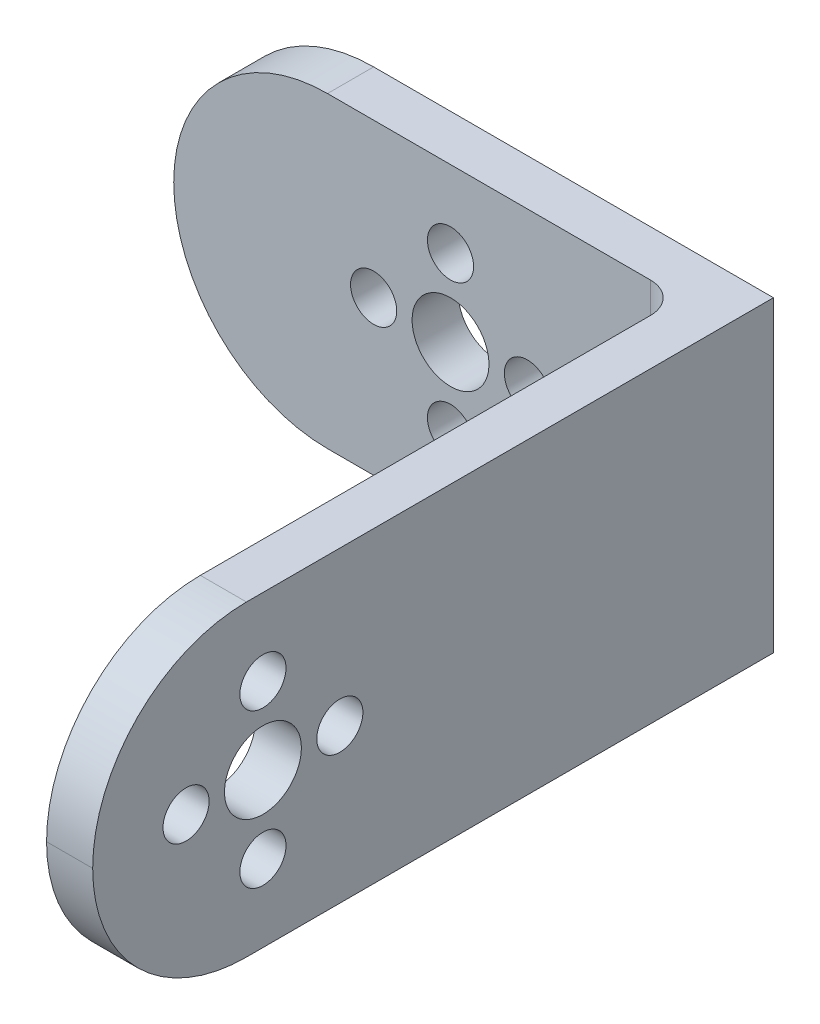
ISO-10303-21;
HEADER;
FILE_DESCRIPTION(('STEP AP214'),'2;1');
FILE_NAME('part.step','',(''),(''),'','','');
FILE_SCHEMA(('AUTOMOTIVE_DESIGN { 1 0 10303 214 1 1 1 1 }'));
ENDSEC;
DATA;
#1=APPLICATION_CONTEXT('core data for automotive mechanical design processes');
#2=APPLICATION_PROTOCOL_DEFINITION('international standard','automotive_design',2000,#1);
#3=PRODUCT_CONTEXT('',#1,'mechanical');
#4=PRODUCT('Part','Part','',(#3));
#5=PRODUCT_RELATED_PRODUCT_CATEGORY('part','',(#4));
#6=PRODUCT_DEFINITION_FORMATION('','',#4);
#7=PRODUCT_DEFINITION_CONTEXT('part definition',#1,'design');
#8=PRODUCT_DEFINITION('design','',#6,#7);
#9=PRODUCT_DEFINITION_SHAPE('','',#8);
#10=(LENGTH_UNIT() NAMED_UNIT(*) SI_UNIT(.MILLI.,.METRE.));
#11=(NAMED_UNIT(*) PLANE_ANGLE_UNIT() SI_UNIT($,.RADIAN.));
#12=(NAMED_UNIT(*) SI_UNIT($,.STERADIAN.) SOLID_ANGLE_UNIT());
#13=UNCERTAINTY_MEASURE_WITH_UNIT(LENGTH_MEASURE(1.E-05),#10,'distance_accuracy_value','');
#14=(GEOMETRIC_REPRESENTATION_CONTEXT(3) GLOBAL_UNCERTAINTY_ASSIGNED_CONTEXT((#13)) GLOBAL_UNIT_ASSIGNED_CONTEXT((#10,
#11,#12)) REPRESENTATION_CONTEXT('',''));
#15=CARTESIAN_POINT('',(0.,0.,0.));
#16=DIRECTION('',(0.,0.,1.));
#17=DIRECTION('',(1.,0.,0.));
#18=AXIS2_PLACEMENT_3D('',#15,#16,#17);
#19=CARTESIAN_POINT('',(0.,20.,41.27));
#20=DIRECTION('',(0.,1.,0.));
#21=DIRECTION('',(0.,0.,1.));
#22=AXIS2_PLACEMENT_3D('',#19,#20,#21);
#23=PLANE('',#22);
#24=DIRECTION('',(1.,0.,0.));
#25=VECTOR('',#24,1.);
#26=CARTESIAN_POINT('',(0.,20.,-3.));
#27=LINE('',#26,#25);
#28=CARTESIAN_POINT('',(10.,20.,-3.));
#29=VERTEX_POINT('',#28);
#30=CARTESIAN_POINT('',(36.,20.,-3.));
#31=VERTEX_POINT('',#30);
#32=EDGE_CURVE('E113',#29,#31,#27,.T.);
#33=ORIENTED_EDGE('',*,*,#32,.F.);
#34=DIRECTION('',(0.,0.,1.));
#35=VECTOR('',#34,1.);
#36=CARTESIAN_POINT('',(10.,20.,0.));
#37=LINE('',#36,#35);
#38=CARTESIAN_POINT('',(10.,20.,0.));
#39=VERTEX_POINT('',#38);
#40=EDGE_CURVE('E163',#29,#39,#37,.T.);
#41=ORIENTED_EDGE('',*,*,#40,.T.);
#42=DIRECTION('',(1.,0.,0.));
#43=VECTOR('',#42,1.);
#44=CARTESIAN_POINT('',(0.,20.,0.));
#45=LINE('',#44,#43);
#46=CARTESIAN_POINT('',(31.,20.,0.));
#47=VERTEX_POINT('',#46);
#48=EDGE_CURVE('E141',#39,#47,#45,.T.);
#49=ORIENTED_EDGE('',*,*,#48,.T.);
#50=CARTESIAN_POINT('',(31.,20.,2.));
#51=DIRECTION('',(0.,1.,0.));
#52=DIRECTION('',(0.,0.,1.));
#53=AXIS2_PLACEMENT_3D('',#50,#51,#52);
#54=CIRCLE('',#53,2.);
#55=CARTESIAN_POINT('',(33.,20.,2.));
#56=VERTEX_POINT('',#55);
#57=EDGE_CURVE('E159',#47,#56,#54,.F.);
#58=ORIENTED_EDGE('',*,*,#57,.T.);
#59=DIRECTION('',(0.,0.,-1.));
#60=VECTOR('',#59,1.);
#61=CARTESIAN_POINT('',(33.,20.,41.27));
#62=LINE('',#61,#60);
#63=CARTESIAN_POINT('',(33.,20.,31.27));
#64=VERTEX_POINT('',#63);
#65=EDGE_CURVE('E148',#64,#56,#62,.T.);
#66=ORIENTED_EDGE('',*,*,#65,.F.);
#67=DIRECTION('',(1.,0.,0.));
#68=VECTOR('',#67,1.);
#69=CARTESIAN_POINT('',(0.,20.,31.27));
#70=LINE('',#69,#68);
#71=CARTESIAN_POINT('',(36.,20.,31.27));
#72=VERTEX_POINT('',#71);
#73=EDGE_CURVE('E130',#64,#72,#70,.T.);
#74=ORIENTED_EDGE('',*,*,#73,.T.);
#75=DIRECTION('',(0.,0.,-1.));
#76=VECTOR('',#75,1.);
#77=CARTESIAN_POINT('',(36.,20.,41.27));
#78=LINE('',#77,#76);
#79=EDGE_CURVE('E127',#72,#31,#78,.T.);
#80=ORIENTED_EDGE('',*,*,#79,.T.);
#81=EDGE_LOOP('',(#33,#41,#49,#58,#66,#74,#80));
#82=FACE_BOUND('',#81,.T.);
#83=ADVANCED_FACE('F41',(#82),#23,.T.);
#84=CARTESIAN_POINT('',(33.,0.,41.27));
#85=DIRECTION('',(1.,0.,0.));
#86=DIRECTION('',(0.,0.,-1.));
#87=AXIS2_PLACEMENT_3D('',#84,#85,#86);
#88=PLANE('',#87);
#89=CARTESIAN_POINT('',(33.,15.,30.1978748806243));
#90=DIRECTION('',(1.,0.,0.));
#91=DIRECTION('',(0.,0.,-1.));
#92=AXIS2_PLACEMENT_3D('',#89,#90,#91);
#93=CIRCLE('',#92,1.5);
#94=CARTESIAN_POINT('',(33.,15.,28.6978748806243));
#95=VERTEX_POINT('',#94);
#96=EDGE_CURVE('E143',#95,#95,#93,.T.);
#97=ORIENTED_EDGE('',*,*,#96,.T.);
#98=EDGE_LOOP('',(#97));
#99=FACE_BOUND('',#98,.T.);
#100=CARTESIAN_POINT('',(33.,10.,30.1978748806243));
#101=DIRECTION('',(1.,0.,0.));
#102=DIRECTION('',(0.,0.,-1.));
#103=AXIS2_PLACEMENT_3D('',#100,#101,#102);
#104=CIRCLE('',#103,2.49999999999999);
#105=CARTESIAN_POINT('',(33.,10.,27.6978748806243));
#106=VERTEX_POINT('',#105);
#107=EDGE_CURVE('E383',#106,#106,#104,.T.);
#108=ORIENTED_EDGE('',*,*,#107,.T.);
#109=EDGE_LOOP('',(#108));
#110=FACE_BOUND('',#109,.T.);
#111=CARTESIAN_POINT('',(33.,10.,25.1978748806243));
#112=DIRECTION('',(1.,0.,0.));
#113=DIRECTION('',(0.,0.,-1.));
#114=AXIS2_PLACEMENT_3D('',#111,#112,#113);
#115=CIRCLE('',#114,1.5);
#116=CARTESIAN_POINT('',(33.,10.,23.6978748806243));
#117=VERTEX_POINT('',#116);
#118=EDGE_CURVE('E379',#117,#117,#115,.T.);
#119=ORIENTED_EDGE('',*,*,#118,.T.);
#120=EDGE_LOOP('',(#119));
#121=FACE_BOUND('',#120,.T.);
#122=CARTESIAN_POINT('',(33.,10.,35.1978748806243));
#123=DIRECTION('',(1.,0.,0.));
#124=DIRECTION('',(0.,0.,-1.));
#125=AXIS2_PLACEMENT_3D('',#122,#123,#124);
#126=CIRCLE('',#125,1.50000000000001);
#127=CARTESIAN_POINT('',(33.,10.,33.6978748806243));
#128=VERTEX_POINT('',#127);
#129=EDGE_CURVE('E377',#128,#128,#126,.T.);
#130=ORIENTED_EDGE('',*,*,#129,.T.);
#131=EDGE_LOOP('',(#130));
#132=FACE_BOUND('',#131,.T.);
#133=CARTESIAN_POINT('',(33.,5.,30.1978748806243));
#134=DIRECTION('',(1.,0.,0.));
#135=DIRECTION('',(0.,0.,-1.));
#136=AXIS2_PLACEMENT_3D('',#133,#134,#135);
#137=CIRCLE('',#136,1.5);
#138=CARTESIAN_POINT('',(33.,5.,28.6978748806243));
#139=VERTEX_POINT('',#138);
#140=EDGE_CURVE('E380',#139,#139,#137,.T.);
#141=ORIENTED_EDGE('',*,*,#140,.T.);
#142=EDGE_LOOP('',(#141));
#143=FACE_BOUND('',#142,.T.);
#144=CARTESIAN_POINT('',(33.,10.,31.27));
#145=DIRECTION('',(1.,0.,0.));
#146=DIRECTION('',(0.,0.,-1.));
#147=AXIS2_PLACEMENT_3D('',#144,#145,#146);
#148=CIRCLE('',#147,10.);
#149=CARTESIAN_POINT('',(33.,0.,31.27));
#150=VERTEX_POINT('',#149);
#151=CARTESIAN_POINT('',(33.,10.,41.27));
#152=VERTEX_POINT('',#151);
#153=EDGE_CURVE('E50',#150,#152,#148,.F.);
#154=ORIENTED_EDGE('',*,*,#153,.T.);
#155=CARTESIAN_POINT('',(33.,10.,31.27));
#156=DIRECTION('',(1.,0.,0.));
#157=DIRECTION('',(0.,0.,-1.));
#158=AXIS2_PLACEMENT_3D('',#155,#156,#157);
#159=CIRCLE('',#158,10.);
#160=EDGE_CURVE('E11',#152,#64,#159,.F.);
#161=ORIENTED_EDGE('',*,*,#160,.T.);
#162=ORIENTED_EDGE('',*,*,#65,.T.);
#163=DIRECTION('',(0.,-1.,0.));
#164=VECTOR('',#163,1.);
#165=CARTESIAN_POINT('',(33.,0.,2.));
#166=LINE('',#165,#164);
#167=CARTESIAN_POINT('',(33.,0.,2.));
#168=VERTEX_POINT('',#167);
#169=EDGE_CURVE('E150',#56,#168,#166,.T.);
#170=ORIENTED_EDGE('',*,*,#169,.T.);
#171=DIRECTION('',(0.,0.,-1.));
#172=VECTOR('',#171,1.);
#173=CARTESIAN_POINT('',(33.,0.,41.27));
#174=LINE('',#173,#172);
#175=EDGE_CURVE('E146',#150,#168,#174,.T.);
#176=ORIENTED_EDGE('',*,*,#175,.F.);
#177=EDGE_LOOP('',(#154,#161,#162,#170,#176));
#178=FACE_BOUND('',#177,.T.);
#179=ADVANCED_FACE('F219',(#99,#110,#121,#132,#143,#178),#88,.F.);
#180=CARTESIAN_POINT('',(0.,0.,41.27));
#181=DIRECTION('',(0.,1.,0.));
#182=DIRECTION('',(0.,0.,1.));
#183=AXIS2_PLACEMENT_3D('',#180,#181,#182);
#184=PLANE('',#183);
#185=DIRECTION('',(1.,0.,0.));
#186=VECTOR('',#185,1.);
#187=CARTESIAN_POINT('',(0.,0.,0.));
#188=LINE('',#187,#186);
#189=CARTESIAN_POINT('',(10.,0.,0.));
#190=VERTEX_POINT('',#189);
#191=CARTESIAN_POINT('',(31.,0.,0.));
#192=VERTEX_POINT('',#191);
#193=EDGE_CURVE('E124',#190,#192,#188,.T.);
#194=ORIENTED_EDGE('',*,*,#193,.F.);
#195=DIRECTION('',(0.,0.,1.));
#196=VECTOR('',#195,1.);
#197=CARTESIAN_POINT('',(10.,0.,41.27));
#198=LINE('',#197,#196);
#199=CARTESIAN_POINT('',(10.,0.,-3.));
#200=VERTEX_POINT('',#199);
#201=EDGE_CURVE('E174',#190,#200,#198,.F.);
#202=ORIENTED_EDGE('',*,*,#201,.T.);
#203=DIRECTION('',(1.,0.,0.));
#204=VECTOR('',#203,1.);
#205=CARTESIAN_POINT('',(0.,0.,-3.));
#206=LINE('',#205,#204);
#207=CARTESIAN_POINT('',(36.,0.,-3.));
#208=VERTEX_POINT('',#207);
#209=EDGE_CURVE('E132',#200,#208,#206,.T.);
#210=ORIENTED_EDGE('',*,*,#209,.T.);
#211=DIRECTION('',(0.,0.,-1.));
#212=VECTOR('',#211,1.);
#213=CARTESIAN_POINT('',(36.,0.,41.27));
#214=LINE('',#213,#212);
#215=CARTESIAN_POINT('',(36.,0.,31.27));
#216=VERTEX_POINT('',#215);
#217=EDGE_CURVE('E131',#216,#208,#214,.T.);
#218=ORIENTED_EDGE('',*,*,#217,.F.);
#219=DIRECTION('',(1.,0.,0.));
#220=VECTOR('',#219,1.);
#221=CARTESIAN_POINT('',(33.,0.,31.27));
#222=LINE('',#221,#220);
#223=EDGE_CURVE('E172',#216,#150,#222,.F.);
#224=ORIENTED_EDGE('',*,*,#223,.T.);
#225=ORIENTED_EDGE('',*,*,#175,.T.);
#226=CARTESIAN_POINT('',(31.,0.,2.));
#227=DIRECTION('',(0.,1.,0.));
#228=DIRECTION('',(0.,0.,1.));
#229=AXIS2_PLACEMENT_3D('',#226,#227,#228);
#230=CIRCLE('',#229,2.);
#231=EDGE_CURVE('E156',#168,#192,#230,.T.);
#232=ORIENTED_EDGE('',*,*,#231,.T.);
#233=EDGE_LOOP('',(#194,#202,#210,#218,#224,#225,#232));
#234=FACE_BOUND('',#233,.T.);
#235=ADVANCED_FACE('F225',(#234),#184,.F.);
#236=CARTESIAN_POINT('',(36.,0.,41.27));
#237=DIRECTION('',(-1.,0.,0.));
#238=DIRECTION('',(0.,0.,1.));
#239=AXIS2_PLACEMENT_3D('',#236,#237,#238);
#240=PLANE('',#239);
#241=CARTESIAN_POINT('',(36.,15.,30.1978748806243));
#242=DIRECTION('',(1.,0.,0.));
#243=DIRECTION('',(0.,0.,-1.));
#244=AXIS2_PLACEMENT_3D('',#241,#242,#243);
#245=CIRCLE('',#244,1.5);
#246=CARTESIAN_POINT('',(36.,15.,28.6978748806243));
#247=VERTEX_POINT('',#246);
#248=EDGE_CURVE('E386',#247,#247,#245,.T.);
#249=ORIENTED_EDGE('',*,*,#248,.F.);
#250=EDGE_LOOP('',(#249));
#251=FACE_BOUND('',#250,.T.);
#252=CARTESIAN_POINT('',(36.,10.,30.1978748806243));
#253=DIRECTION('',(1.,0.,0.));
#254=DIRECTION('',(0.,0.,-1.));
#255=AXIS2_PLACEMENT_3D('',#252,#253,#254);
#256=CIRCLE('',#255,2.49999999999999);
#257=CARTESIAN_POINT('',(36.,10.,27.6978748806243));
#258=VERTEX_POINT('',#257);
#259=EDGE_CURVE('E183',#258,#258,#256,.T.);
#260=ORIENTED_EDGE('',*,*,#259,.F.);
#261=EDGE_LOOP('',(#260));
#262=FACE_BOUND('',#261,.T.);
#263=CARTESIAN_POINT('',(36.,10.,25.1978748806243));
#264=DIRECTION('',(1.,0.,0.));
#265=DIRECTION('',(0.,0.,-1.));
#266=AXIS2_PLACEMENT_3D('',#263,#264,#265);
#267=CIRCLE('',#266,1.5);
#268=CARTESIAN_POINT('',(36.,10.,23.6978748806243));
#269=VERTEX_POINT('',#268);
#270=EDGE_CURVE('E405',#269,#269,#267,.T.);
#271=ORIENTED_EDGE('',*,*,#270,.F.);
#272=EDGE_LOOP('',(#271));
#273=FACE_BOUND('',#272,.T.);
#274=CARTESIAN_POINT('',(36.,10.,35.1978748806243));
#275=DIRECTION('',(1.,0.,0.));
#276=DIRECTION('',(0.,0.,-1.));
#277=AXIS2_PLACEMENT_3D('',#274,#275,#276);
#278=CIRCLE('',#277,1.50000000000001);
#279=CARTESIAN_POINT('',(36.,10.,33.6978748806243));
#280=VERTEX_POINT('',#279);
#281=EDGE_CURVE('E374',#280,#280,#278,.T.);
#282=ORIENTED_EDGE('',*,*,#281,.F.);
#283=EDGE_LOOP('',(#282));
#284=FACE_BOUND('',#283,.T.);
#285=CARTESIAN_POINT('',(36.,5.,30.1978748806243));
#286=DIRECTION('',(1.,0.,0.));
#287=DIRECTION('',(0.,0.,-1.));
#288=AXIS2_PLACEMENT_3D('',#285,#286,#287);
#289=CIRCLE('',#288,1.5);
#290=CARTESIAN_POINT('',(36.,5.,28.6978748806243));
#291=VERTEX_POINT('',#290);
#292=EDGE_CURVE('E404',#291,#291,#289,.T.);
#293=ORIENTED_EDGE('',*,*,#292,.F.);
#294=EDGE_LOOP('',(#293));
#295=FACE_BOUND('',#294,.T.);
#296=ORIENTED_EDGE('',*,*,#79,.F.);
#297=CARTESIAN_POINT('',(36.,10.,31.27));
#298=DIRECTION('',(-1.,0.,0.));
#299=DIRECTION('',(0.,0.,1.));
#300=AXIS2_PLACEMENT_3D('',#297,#298,#299);
#301=CIRCLE('',#300,10.);
#302=CARTESIAN_POINT('',(36.,10.,41.27));
#303=VERTEX_POINT('',#302);
#304=EDGE_CURVE('E64',#72,#303,#301,.F.);
#305=ORIENTED_EDGE('',*,*,#304,.T.);
#306=CARTESIAN_POINT('',(36.,10.,31.27));
#307=DIRECTION('',(-1.,0.,0.));
#308=DIRECTION('',(0.,0.,1.));
#309=AXIS2_PLACEMENT_3D('',#306,#307,#308);
#310=CIRCLE('',#309,10.);
#311=EDGE_CURVE('E176',#303,#216,#310,.F.);
#312=ORIENTED_EDGE('',*,*,#311,.T.);
#313=ORIENTED_EDGE('',*,*,#217,.T.);
#314=DIRECTION('',(0.,1.,0.));
#315=VECTOR('',#314,1.);
#316=CARTESIAN_POINT('',(36.,0.,-3.));
#317=LINE('',#316,#315);
#318=EDGE_CURVE('E118',#208,#31,#317,.T.);
#319=ORIENTED_EDGE('',*,*,#318,.T.);
#320=EDGE_LOOP('',(#296,#305,#312,#313,#319));
#321=FACE_BOUND('',#320,.T.);
#322=ADVANCED_FACE('F134',(#251,#262,#273,#284,#295,#321),#240,.F.);
#323=CARTESIAN_POINT('',(0.,0.,-3.));
#324=DIRECTION('',(0.,0.,-1.));
#325=DIRECTION('',(-1.,0.,0.));
#326=AXIS2_PLACEMENT_3D('',#323,#324,#325);
#327=PLANE('',#326);
#328=CARTESIAN_POINT('',(22.9999999999999,9.99999999999998,-3.));
#329=DIRECTION('',(0.,0.,-1.));
#330=DIRECTION('',(-1.,0.,0.));
#331=AXIS2_PLACEMENT_3D('',#328,#329,#330);
#332=CIRCLE('',#331,1.5);
#333=CARTESIAN_POINT('',(21.4999999999999,9.99999999999998,-3.));
#334=VERTEX_POINT('',#333);
#335=EDGE_CURVE('E191',#334,#334,#332,.T.);
#336=ORIENTED_EDGE('',*,*,#335,.F.);
#337=EDGE_LOOP('',(#336));
#338=FACE_BOUND('',#337,.T.);
#339=CARTESIAN_POINT('',(18.,10.,-3.));
#340=DIRECTION('',(0.,0.,-1.));
#341=DIRECTION('',(-1.,0.,0.));
#342=AXIS2_PLACEMENT_3D('',#339,#340,#341);
#343=CIRCLE('',#342,2.49999999999999);
#344=CARTESIAN_POINT('',(15.5,10.,-3.));
#345=VERTEX_POINT('',#344);
#346=EDGE_CURVE('E421',#345,#345,#343,.T.);
#347=ORIENTED_EDGE('',*,*,#346,.F.);
#348=EDGE_LOOP('',(#347));
#349=FACE_BOUND('',#348,.T.);
#350=CARTESIAN_POINT('',(18.,5.,-3.));
#351=DIRECTION('',(0.,0.,-1.));
#352=DIRECTION('',(-1.,0.,0.));
#353=AXIS2_PLACEMENT_3D('',#350,#351,#352);
#354=CIRCLE('',#353,1.5);
#355=CARTESIAN_POINT('',(16.5,5.,-3.));
#356=VERTEX_POINT('',#355);
#357=EDGE_CURVE('E418',#356,#356,#354,.T.);
#358=ORIENTED_EDGE('',*,*,#357,.F.);
#359=EDGE_LOOP('',(#358));
#360=FACE_BOUND('',#359,.T.);
#361=CARTESIAN_POINT('',(12.9999999999999,10.0000000000001,-3.));
#362=DIRECTION('',(0.,0.,-1.));
#363=DIRECTION('',(-1.,0.,0.));
#364=AXIS2_PLACEMENT_3D('',#361,#362,#363);
#365=CIRCLE('',#364,1.5);
#366=CARTESIAN_POINT('',(11.4999999999999,10.0000000000001,-3.));
#367=VERTEX_POINT('',#366);
#368=EDGE_CURVE('E414',#367,#367,#365,.T.);
#369=ORIENTED_EDGE('',*,*,#368,.F.);
#370=EDGE_LOOP('',(#369));
#371=FACE_BOUND('',#370,.T.);
#372=CARTESIAN_POINT('',(18.,15.,-3.));
#373=DIRECTION('',(0.,0.,-1.));
#374=DIRECTION('',(-1.,0.,0.));
#375=AXIS2_PLACEMENT_3D('',#372,#373,#374);
#376=CIRCLE('',#375,1.5);
#377=CARTESIAN_POINT('',(16.5,15.,-3.));
#378=VERTEX_POINT('',#377);
#379=EDGE_CURVE('E417',#378,#378,#376,.T.);
#380=ORIENTED_EDGE('',*,*,#379,.F.);
#381=EDGE_LOOP('',(#380));
#382=FACE_BOUND('',#381,.T.);
#383=CARTESIAN_POINT('',(10.,10.,-3.));
#384=DIRECTION('',(0.,0.,-1.));
#385=DIRECTION('',(-1.,0.,0.));
#386=AXIS2_PLACEMENT_3D('',#383,#384,#385);
#387=CIRCLE('',#386,10.);
#388=CARTESIAN_POINT('',(0.,10.,-3.));
#389=VERTEX_POINT('',#388);
#390=EDGE_CURVE('E169',#200,#389,#387,.T.);
#391=ORIENTED_EDGE('',*,*,#390,.T.);
#392=CARTESIAN_POINT('',(10.,10.,-3.));
#393=DIRECTION('',(0.,0.,-1.));
#394=DIRECTION('',(-1.,0.,0.));
#395=AXIS2_PLACEMENT_3D('',#392,#393,#394);
#396=CIRCLE('',#395,10.);
#397=EDGE_CURVE('E120',#389,#29,#396,.T.);
#398=ORIENTED_EDGE('',*,*,#397,.T.);
#399=ORIENTED_EDGE('',*,*,#32,.T.);
#400=ORIENTED_EDGE('',*,*,#318,.F.);
#401=ORIENTED_EDGE('',*,*,#209,.F.);
#402=EDGE_LOOP('',(#391,#398,#399,#400,#401));
#403=FACE_BOUND('',#402,.T.);
#404=ADVANCED_FACE('F115',(#338,#349,#360,#371,#382,#403),#327,.T.);
#405=CARTESIAN_POINT('',(0.,0.,0.));
#406=DIRECTION('',(0.,0.,-1.));
#407=DIRECTION('',(-1.,0.,0.));
#408=AXIS2_PLACEMENT_3D('',#405,#406,#407);
#409=PLANE('',#408);
#410=CARTESIAN_POINT('',(22.9999999999999,9.99999999999998,0.));
#411=DIRECTION('',(0.,0.,-1.));
#412=DIRECTION('',(-1.,0.,0.));
#413=AXIS2_PLACEMENT_3D('',#410,#411,#412);
#414=CIRCLE('',#413,1.5);
#415=CARTESIAN_POINT('',(21.4999999999999,9.99999999999998,0.));
#416=VERTEX_POINT('',#415);
#417=EDGE_CURVE('E45',#416,#416,#414,.T.);
#418=ORIENTED_EDGE('',*,*,#417,.T.);
#419=EDGE_LOOP('',(#418));
#420=FACE_BOUND('',#419,.T.);
#421=CARTESIAN_POINT('',(18.,10.,0.));
#422=DIRECTION('',(0.,0.,-1.));
#423=DIRECTION('',(-1.,0.,0.));
#424=AXIS2_PLACEMENT_3D('',#421,#422,#423);
#425=CIRCLE('',#424,2.49999999999999);
#426=CARTESIAN_POINT('',(15.5,10.,0.));
#427=VERTEX_POINT('',#426);
#428=EDGE_CURVE('E196',#427,#427,#425,.T.);
#429=ORIENTED_EDGE('',*,*,#428,.T.);
#430=EDGE_LOOP('',(#429));
#431=FACE_BOUND('',#430,.T.);
#432=CARTESIAN_POINT('',(18.,5.,0.));
#433=DIRECTION('',(0.,0.,-1.));
#434=DIRECTION('',(-1.,0.,0.));
#435=AXIS2_PLACEMENT_3D('',#432,#433,#434);
#436=CIRCLE('',#435,1.5);
#437=CARTESIAN_POINT('',(16.5,5.,0.));
#438=VERTEX_POINT('',#437);
#439=EDGE_CURVE('E194',#438,#438,#436,.T.);
#440=ORIENTED_EDGE('',*,*,#439,.T.);
#441=EDGE_LOOP('',(#440));
#442=FACE_BOUND('',#441,.T.);
#443=CARTESIAN_POINT('',(12.9999999999999,10.0000000000001,0.));
#444=DIRECTION('',(0.,0.,-1.));
#445=DIRECTION('',(-1.,0.,0.));
#446=AXIS2_PLACEMENT_3D('',#443,#444,#445);
#447=CIRCLE('',#446,1.5);
#448=CARTESIAN_POINT('',(11.4999999999999,10.0000000000001,0.));
#449=VERTEX_POINT('',#448);
#450=EDGE_CURVE('E190',#449,#449,#447,.T.);
#451=ORIENTED_EDGE('',*,*,#450,.T.);
#452=EDGE_LOOP('',(#451));
#453=FACE_BOUND('',#452,.T.);
#454=CARTESIAN_POINT('',(18.,15.,0.));
#455=DIRECTION('',(0.,0.,-1.));
#456=DIRECTION('',(-1.,0.,0.));
#457=AXIS2_PLACEMENT_3D('',#454,#455,#456);
#458=CIRCLE('',#457,1.5);
#459=CARTESIAN_POINT('',(16.5,15.,0.));
#460=VERTEX_POINT('',#459);
#461=EDGE_CURVE('E187',#460,#460,#458,.T.);
#462=ORIENTED_EDGE('',*,*,#461,.T.);
#463=EDGE_LOOP('',(#462));
#464=FACE_BOUND('',#463,.T.);
#465=ORIENTED_EDGE('',*,*,#48,.F.);
#466=CARTESIAN_POINT('',(10.,10.,0.));
#467=DIRECTION('',(0.,0.,-1.));
#468=DIRECTION('',(-1.,0.,0.));
#469=AXIS2_PLACEMENT_3D('',#466,#467,#468);
#470=CIRCLE('',#469,10.);
#471=CARTESIAN_POINT('',(0.,10.,0.));
#472=VERTEX_POINT('',#471);
#473=EDGE_CURVE('E167',#39,#472,#470,.F.);
#474=ORIENTED_EDGE('',*,*,#473,.T.);
#475=CARTESIAN_POINT('',(10.,10.,0.));
#476=DIRECTION('',(0.,0.,-1.));
#477=DIRECTION('',(-1.,0.,0.));
#478=AXIS2_PLACEMENT_3D('',#475,#476,#477);
#479=CIRCLE('',#478,10.);
#480=EDGE_CURVE('E165',#472,#190,#479,.F.);
#481=ORIENTED_EDGE('',*,*,#480,.T.);
#482=ORIENTED_EDGE('',*,*,#193,.T.);
#483=DIRECTION('',(0.,-1.,0.));
#484=VECTOR('',#483,1.);
#485=CARTESIAN_POINT('',(31.,20.,0.));
#486=LINE('',#485,#484);
#487=EDGE_CURVE('E153',#192,#47,#486,.F.);
#488=ORIENTED_EDGE('',*,*,#487,.T.);
#489=EDGE_LOOP('',(#465,#474,#481,#482,#488));
#490=FACE_BOUND('',#489,.T.);
#491=ADVANCED_FACE('F203',(#420,#431,#442,#453,#464,#490),#409,.F.);
#492=CARTESIAN_POINT('',(-49.,5.,30.1978748806243));
#493=DIRECTION('',(1.,0.,0.));
#494=DIRECTION('',(0.,0.,-1.));
#495=AXIS2_PLACEMENT_3D('',#492,#493,#494);
#496=CYLINDRICAL_SURFACE('',#495,1.5);
#497=ORIENTED_EDGE('',*,*,#292,.T.);
#498=EDGE_LOOP('',(#497));
#499=FACE_BOUND('',#498,.T.);
#500=ORIENTED_EDGE('',*,*,#140,.F.);
#501=EDGE_LOOP('',(#500));
#502=FACE_BOUND('',#501,.T.);
#503=ADVANCED_FACE('F269',(#499,#502),#496,.F.);
#504=CARTESIAN_POINT('',(-49.,10.,35.1978748806243));
#505=DIRECTION('',(1.,0.,0.));
#506=DIRECTION('',(0.,0.,-1.));
#507=AXIS2_PLACEMENT_3D('',#504,#505,#506);
#508=CYLINDRICAL_SURFACE('',#507,1.50000000000001);
#509=ORIENTED_EDGE('',*,*,#281,.T.);
#510=EDGE_LOOP('',(#509));
#511=FACE_BOUND('',#510,.T.);
#512=ORIENTED_EDGE('',*,*,#129,.F.);
#513=EDGE_LOOP('',(#512));
#514=FACE_BOUND('',#513,.T.);
#515=ADVANCED_FACE('F274',(#511,#514),#508,.F.);
#516=CARTESIAN_POINT('',(-49.,10.,25.1978748806243));
#517=DIRECTION('',(1.,0.,0.));
#518=DIRECTION('',(0.,0.,-1.));
#519=AXIS2_PLACEMENT_3D('',#516,#517,#518);
#520=CYLINDRICAL_SURFACE('',#519,1.5);
#521=ORIENTED_EDGE('',*,*,#270,.T.);
#522=EDGE_LOOP('',(#521));
#523=FACE_BOUND('',#522,.T.);
#524=ORIENTED_EDGE('',*,*,#118,.F.);
#525=EDGE_LOOP('',(#524));
#526=FACE_BOUND('',#525,.T.);
#527=ADVANCED_FACE('F361',(#523,#526),#520,.F.);
#528=CARTESIAN_POINT('',(-49.,10.,30.1978748806243));
#529=DIRECTION('',(1.,0.,0.));
#530=DIRECTION('',(0.,0.,-1.));
#531=AXIS2_PLACEMENT_3D('',#528,#529,#530);
#532=CYLINDRICAL_SURFACE('',#531,2.49999999999999);
#533=ORIENTED_EDGE('',*,*,#259,.T.);
#534=EDGE_LOOP('',(#533));
#535=FACE_BOUND('',#534,.T.);
#536=ORIENTED_EDGE('',*,*,#107,.F.);
#537=EDGE_LOOP('',(#536));
#538=FACE_BOUND('',#537,.T.);
#539=ADVANCED_FACE('F359',(#535,#538),#532,.F.);
#540=CARTESIAN_POINT('',(-49.,15.,30.1978748806243));
#541=DIRECTION('',(1.,0.,0.));
#542=DIRECTION('',(0.,0.,-1.));
#543=AXIS2_PLACEMENT_3D('',#540,#541,#542);
#544=CYLINDRICAL_SURFACE('',#543,1.5);
#545=ORIENTED_EDGE('',*,*,#248,.T.);
#546=EDGE_LOOP('',(#545));
#547=FACE_BOUND('',#546,.T.);
#548=ORIENTED_EDGE('',*,*,#96,.F.);
#549=EDGE_LOOP('',(#548));
#550=FACE_BOUND('',#549,.T.);
#551=ADVANCED_FACE('F233',(#547,#550),#544,.F.);
#552=CARTESIAN_POINT('',(31.,0.,2.));
#553=DIRECTION('',(0.,1.,0.));
#554=DIRECTION('',(0.,0.,1.));
#555=AXIS2_PLACEMENT_3D('',#552,#553,#554);
#556=CYLINDRICAL_SURFACE('',#555,2.);
#557=ORIENTED_EDGE('',*,*,#57,.F.);
#558=ORIENTED_EDGE('',*,*,#487,.F.);
#559=ORIENTED_EDGE('',*,*,#231,.F.);
#560=ORIENTED_EDGE('',*,*,#169,.F.);
#561=EDGE_LOOP('',(#557,#558,#559,#560));
#562=FACE_BOUND('',#561,.T.);
#563=ADVANCED_FACE('F230',(#562),#556,.F.);
#564=CARTESIAN_POINT('',(10.,10.,-3.));
#565=DIRECTION('',(0.,0.,1.));
#566=DIRECTION('',(1.,0.,0.));
#567=AXIS2_PLACEMENT_3D('',#564,#565,#566);
#568=CYLINDRICAL_SURFACE('',#567,10.);
#569=DIRECTION('',(0.,0.,1.));
#570=VECTOR('',#569,1.);
#571=CARTESIAN_POINT('',(0.,10.,-3.));
#572=LINE('',#571,#570);
#573=EDGE_CURVE('E180',#389,#472,#572,.T.);
#574=ORIENTED_EDGE('',*,*,#573,.F.);
#575=ORIENTED_EDGE('',*,*,#390,.F.);
#576=ORIENTED_EDGE('',*,*,#201,.F.);
#577=ORIENTED_EDGE('',*,*,#480,.F.);
#578=EDGE_LOOP('',(#574,#575,#576,#577));
#579=FACE_BOUND('',#578,.T.);
#580=ADVANCED_FACE('F232',(#579),#568,.T.);
#581=CARTESIAN_POINT('',(10.,10.,41.27));
#582=DIRECTION('',(0.,0.,-1.));
#583=DIRECTION('',(-1.,0.,0.));
#584=AXIS2_PLACEMENT_3D('',#581,#582,#583);
#585=CYLINDRICAL_SURFACE('',#584,10.);
#586=ORIENTED_EDGE('',*,*,#397,.F.);
#587=ORIENTED_EDGE('',*,*,#573,.T.);
#588=ORIENTED_EDGE('',*,*,#473,.F.);
#589=ORIENTED_EDGE('',*,*,#40,.F.);
#590=EDGE_LOOP('',(#586,#587,#588,#589));
#591=FACE_BOUND('',#590,.T.);
#592=ADVANCED_FACE('F235',(#591),#585,.T.);
#593=CARTESIAN_POINT('',(0.,10.,31.27));
#594=DIRECTION('',(-1.,0.,0.));
#595=DIRECTION('',(0.,0.,1.));
#596=AXIS2_PLACEMENT_3D('',#593,#594,#595);
#597=CYLINDRICAL_SURFACE('',#596,10.);
#598=DIRECTION('',(1.,0.,0.));
#599=VECTOR('',#598,1.);
#600=CARTESIAN_POINT('',(36.,10.,41.27));
#601=LINE('',#600,#599);
#602=EDGE_CURVE('E184',#152,#303,#601,.T.);
#603=ORIENTED_EDGE('',*,*,#602,.F.);
#604=ORIENTED_EDGE('',*,*,#153,.F.);
#605=ORIENTED_EDGE('',*,*,#223,.F.);
#606=ORIENTED_EDGE('',*,*,#311,.F.);
#607=EDGE_LOOP('',(#603,#604,#605,#606));
#608=FACE_BOUND('',#607,.T.);
#609=ADVANCED_FACE('F43',(#608),#597,.T.);
#610=CARTESIAN_POINT('',(0.,10.,31.27));
#611=DIRECTION('',(1.,0.,0.));
#612=DIRECTION('',(0.,0.,-1.));
#613=AXIS2_PLACEMENT_3D('',#610,#611,#612);
#614=CYLINDRICAL_SURFACE('',#613,10.);
#615=ORIENTED_EDGE('',*,*,#160,.F.);
#616=ORIENTED_EDGE('',*,*,#602,.T.);
#617=ORIENTED_EDGE('',*,*,#304,.F.);
#618=ORIENTED_EDGE('',*,*,#73,.F.);
#619=EDGE_LOOP('',(#615,#616,#617,#618));
#620=FACE_BOUND('',#619,.T.);
#621=ADVANCED_FACE('F241',(#620),#614,.T.);
#622=CARTESIAN_POINT('',(18.,15.,7.));
#623=DIRECTION('',(0.,0.,-1.));
#624=DIRECTION('',(-1.,0.,0.));
#625=AXIS2_PLACEMENT_3D('',#622,#623,#624);
#626=CYLINDRICAL_SURFACE('',#625,1.5);
#627=ORIENTED_EDGE('',*,*,#379,.T.);
#628=EDGE_LOOP('',(#627));
#629=FACE_BOUND('',#628,.T.);
#630=ORIENTED_EDGE('',*,*,#461,.F.);
#631=EDGE_LOOP('',(#630));
#632=FACE_BOUND('',#631,.T.);
#633=ADVANCED_FACE('F243',(#629,#632),#626,.F.);
#634=CARTESIAN_POINT('',(12.9999999999999,10.0000000000001,7.));
#635=DIRECTION('',(0.,0.,-1.));
#636=DIRECTION('',(-1.,0.,0.));
#637=AXIS2_PLACEMENT_3D('',#634,#635,#636);
#638=CYLINDRICAL_SURFACE('',#637,1.5);
#639=ORIENTED_EDGE('',*,*,#368,.T.);
#640=EDGE_LOOP('',(#639));
#641=FACE_BOUND('',#640,.T.);
#642=ORIENTED_EDGE('',*,*,#450,.F.);
#643=EDGE_LOOP('',(#642));
#644=FACE_BOUND('',#643,.T.);
#645=ADVANCED_FACE('F250',(#641,#644),#638,.F.);
#646=CARTESIAN_POINT('',(18.,5.,7.));
#647=DIRECTION('',(0.,0.,-1.));
#648=DIRECTION('',(-1.,0.,0.));
#649=AXIS2_PLACEMENT_3D('',#646,#647,#648);
#650=CYLINDRICAL_SURFACE('',#649,1.5);
#651=ORIENTED_EDGE('',*,*,#357,.T.);
#652=EDGE_LOOP('',(#651));
#653=FACE_BOUND('',#652,.T.);
#654=ORIENTED_EDGE('',*,*,#439,.F.);
#655=EDGE_LOOP('',(#654));
#656=FACE_BOUND('',#655,.T.);
#657=ADVANCED_FACE('F213',(#653,#656),#650,.F.);
#658=CARTESIAN_POINT('',(18.,10.,7.));
#659=DIRECTION('',(0.,0.,-1.));
#660=DIRECTION('',(-1.,0.,0.));
#661=AXIS2_PLACEMENT_3D('',#658,#659,#660);
#662=CYLINDRICAL_SURFACE('',#661,2.49999999999999);
#663=ORIENTED_EDGE('',*,*,#346,.T.);
#664=EDGE_LOOP('',(#663));
#665=FACE_BOUND('',#664,.T.);
#666=ORIENTED_EDGE('',*,*,#428,.F.);
#667=EDGE_LOOP('',(#666));
#668=FACE_BOUND('',#667,.T.);
#669=ADVANCED_FACE('F207',(#665,#668),#662,.F.);
#670=CARTESIAN_POINT('',(22.9999999999999,9.99999999999998,7.));
#671=DIRECTION('',(0.,0.,-1.));
#672=DIRECTION('',(-1.,0.,0.));
#673=AXIS2_PLACEMENT_3D('',#670,#671,#672);
#674=CYLINDRICAL_SURFACE('',#673,1.5);
#675=ORIENTED_EDGE('',*,*,#335,.T.);
#676=EDGE_LOOP('',(#675));
#677=FACE_BOUND('',#676,.T.);
#678=ORIENTED_EDGE('',*,*,#417,.F.);
#679=EDGE_LOOP('',(#678));
#680=FACE_BOUND('',#679,.T.);
#681=ADVANCED_FACE('F205',(#677,#680),#674,.F.);
#682=CLOSED_SHELL('',(#83,#179,#235,#322,#404,#491,#503,#515,#527,#539,#551,#563,#580,#592,#609,
#621,#633,#645,#657,#669,#681));
#683=MANIFOLD_SOLID_BREP('B2',#682);
#684=ADVANCED_BREP_SHAPE_REPRESENTATION('',(#18,#683),#14);
#685=SHAPE_DEFINITION_REPRESENTATION(#9,#684);
ENDSEC;
END-ISO-10303-21;
